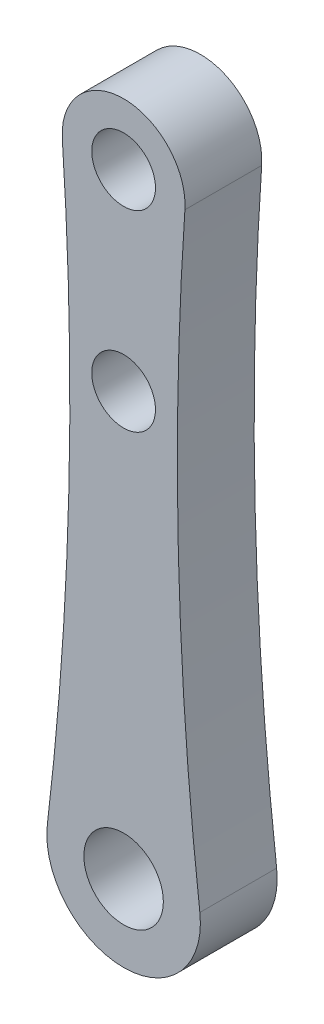
ISO-10303-21;
HEADER;
FILE_DESCRIPTION(('STEP AP214'),'2;1');
FILE_NAME('part.step','',(''),(''),'','','');
FILE_SCHEMA(('AUTOMOTIVE_DESIGN { 1 0 10303 214 1 1 1 1 }'));
ENDSEC;
DATA;
#1=APPLICATION_CONTEXT('core data for automotive mechanical design processes');
#2=APPLICATION_PROTOCOL_DEFINITION('international standard','automotive_design',2000,#1);
#3=PRODUCT_CONTEXT('',#1,'mechanical');
#4=PRODUCT('Part','Part','',(#3));
#5=PRODUCT_RELATED_PRODUCT_CATEGORY('part','',(#4));
#6=PRODUCT_DEFINITION_FORMATION('','',#4);
#7=PRODUCT_DEFINITION_CONTEXT('part definition',#1,'design');
#8=PRODUCT_DEFINITION('design','',#6,#7);
#9=PRODUCT_DEFINITION_SHAPE('','',#8);
#10=(LENGTH_UNIT() NAMED_UNIT(*) SI_UNIT(.MILLI.,.METRE.));
#11=(NAMED_UNIT(*) PLANE_ANGLE_UNIT() SI_UNIT($,.RADIAN.));
#12=(NAMED_UNIT(*) SI_UNIT($,.STERADIAN.) SOLID_ANGLE_UNIT());
#13=UNCERTAINTY_MEASURE_WITH_UNIT(LENGTH_MEASURE(1.E-05),#10,'distance_accuracy_value','');
#14=(GEOMETRIC_REPRESENTATION_CONTEXT(3) GLOBAL_UNCERTAINTY_ASSIGNED_CONTEXT((#13)) GLOBAL_UNIT_ASSIGNED_CONTEXT((#10,
#11,#12)) REPRESENTATION_CONTEXT('',''));
#15=CARTESIAN_POINT('',(0.,0.,0.));
#16=DIRECTION('',(0.,0.,1.));
#17=DIRECTION('',(1.,0.,0.));
#18=AXIS2_PLACEMENT_3D('',#15,#16,#17);
#19=CARTESIAN_POINT('',(-213.79243432618,25.3698108581539,10.));
#20=DIRECTION('',(0.,0.,1.));
#21=DIRECTION('',(1.,0.,0.));
#22=AXIS2_PLACEMENT_3D('',#19,#20,#21);
#23=PLANE('',#22);
#24=CARTESIAN_POINT('',(0.,40.,10.));
#25=DIRECTION('',(0.,0.,1.));
#26=DIRECTION('',(1.,0.,0.));
#27=AXIS2_PLACEMENT_3D('',#24,#25,#26);
#28=CIRCLE('',#27,4.15);
#29=CARTESIAN_POINT('',(4.14999999999999,40.,10.));
#30=VERTEX_POINT('',#29);
#31=EDGE_CURVE('E119',#30,#30,#28,.T.);
#32=ORIENTED_EDGE('',*,*,#31,.F.);
#33=EDGE_LOOP('',(#32));
#34=FACE_BOUND('',#33,.T.);
#35=CARTESIAN_POINT('',(-427.584868652359,10.7396217163078,10.));
#36=DIRECTION('',(0.,0.,-1.));
#37=DIRECTION('',(1.,0.,0.));
#38=AXIS2_PLACEMENT_3D('',#35,#36,#37);
#39=CIRCLE('',#38,420.584868652359);
#40=CARTESIAN_POINT('',(-7.98133391870525,39.4538234002391,10.));
#41=VERTEX_POINT('',#40);
#42=CARTESIAN_POINT('',(-9.9303273241023,-38.8216115936653,10.));
#43=VERTEX_POINT('',#42);
#44=EDGE_CURVE('E89',#41,#43,#39,.T.);
#45=ORIENTED_EDGE('',*,*,#44,.T.);
#46=CARTESIAN_POINT('',(0.,-40.,10.));
#47=DIRECTION('',(0.,0.,1.));
#48=DIRECTION('',(1.,0.,0.));
#49=AXIS2_PLACEMENT_3D('',#46,#47,#48);
#50=CIRCLE('',#49,9.99999999999984);
#51=CARTESIAN_POINT('',(9.93032732410226,-38.8216115936653,10.));
#52=VERTEX_POINT('',#51);
#53=EDGE_CURVE('E84',#43,#52,#50,.T.);
#54=ORIENTED_EDGE('',*,*,#53,.T.);
#55=CARTESIAN_POINT('',(427.584868652359,10.7396217163078,10.));
#56=DIRECTION('',(0.,0.,-1.));
#57=DIRECTION('',(-1.,0.,0.));
#58=AXIS2_PLACEMENT_3D('',#55,#56,#57);
#59=CIRCLE('',#58,420.584868652359);
#60=CARTESIAN_POINT('',(7.98133391870522,39.453823400239,10.));
#61=VERTEX_POINT('',#60);
#62=EDGE_CURVE('E87',#52,#61,#59,.T.);
#63=ORIENTED_EDGE('',*,*,#62,.T.);
#64=CARTESIAN_POINT('',(0.,40.,10.));
#65=DIRECTION('',(0.,0.,1.));
#66=DIRECTION('',(1.,0.,0.));
#67=AXIS2_PLACEMENT_3D('',#64,#65,#66);
#68=CIRCLE('',#67,8.00000000000007);
#69=EDGE_CURVE('E54',#61,#41,#68,.T.);
#70=ORIENTED_EDGE('',*,*,#69,.T.);
#71=EDGE_LOOP('',(#45,#54,#63,#70));
#72=FACE_BOUND('',#71,.T.);
#73=CARTESIAN_POINT('',(0.,-40.,10.));
#74=DIRECTION('',(0.,0.,1.));
#75=DIRECTION('',(1.,0.,0.));
#76=AXIS2_PLACEMENT_3D('',#73,#74,#75);
#77=CIRCLE('',#76,5.175);
#78=CARTESIAN_POINT('',(5.175,-40.,10.));
#79=VERTEX_POINT('',#78);
#80=EDGE_CURVE('E104',#79,#79,#77,.T.);
#81=ORIENTED_EDGE('',*,*,#80,.F.);
#82=EDGE_LOOP('',(#81));
#83=FACE_BOUND('',#82,.T.);
#84=CARTESIAN_POINT('',(0.,15.,10.));
#85=DIRECTION('',(0.,0.,1.));
#86=DIRECTION('',(1.,0.,0.));
#87=AXIS2_PLACEMENT_3D('',#84,#85,#86);
#88=CIRCLE('',#87,4.15);
#89=CARTESIAN_POINT('',(4.15,15.,10.));
#90=VERTEX_POINT('',#89);
#91=EDGE_CURVE('E125',#90,#90,#88,.T.);
#92=ORIENTED_EDGE('',*,*,#91,.F.);
#93=EDGE_LOOP('',(#92));
#94=FACE_BOUND('',#93,.T.);
#95=ADVANCED_FACE('F37',(#34,#72,#83,#94),#23,.T.);
#96=CARTESIAN_POINT('',(-213.79243432618,25.3698108581539,0.));
#97=DIRECTION('',(0.,0.,1.));
#98=DIRECTION('',(1.,0.,0.));
#99=AXIS2_PLACEMENT_3D('',#96,#97,#98);
#100=PLANE('',#99);
#101=CARTESIAN_POINT('',(-427.584868652359,10.7396217163078,0.));
#102=DIRECTION('',(0.,0.,-1.));
#103=DIRECTION('',(1.,0.,0.));
#104=AXIS2_PLACEMENT_3D('',#101,#102,#103);
#105=CIRCLE('',#104,420.584868652359);
#106=CARTESIAN_POINT('',(-7.98133391870525,39.4538234002391,0.));
#107=VERTEX_POINT('',#106);
#108=CARTESIAN_POINT('',(-9.9303273241023,-38.8216115936653,0.));
#109=VERTEX_POINT('',#108);
#110=EDGE_CURVE('E101',#107,#109,#105,.T.);
#111=ORIENTED_EDGE('',*,*,#110,.F.);
#112=CARTESIAN_POINT('',(0.,40.,0.));
#113=DIRECTION('',(0.,0.,1.));
#114=DIRECTION('',(1.,0.,0.));
#115=AXIS2_PLACEMENT_3D('',#112,#113,#114);
#116=CIRCLE('',#115,8.00000000000007);
#117=CARTESIAN_POINT('',(7.98133391870522,39.453823400239,0.));
#118=VERTEX_POINT('',#117);
#119=EDGE_CURVE('E77',#118,#107,#116,.T.);
#120=ORIENTED_EDGE('',*,*,#119,.F.);
#121=CARTESIAN_POINT('',(427.584868652359,10.7396217163078,0.));
#122=DIRECTION('',(0.,0.,-1.));
#123=DIRECTION('',(-1.,0.,0.));
#124=AXIS2_PLACEMENT_3D('',#121,#122,#123);
#125=CIRCLE('',#124,420.584868652359);
#126=CARTESIAN_POINT('',(9.93032732410226,-38.8216115936653,0.));
#127=VERTEX_POINT('',#126);
#128=EDGE_CURVE('E71',#127,#118,#125,.T.);
#129=ORIENTED_EDGE('',*,*,#128,.F.);
#130=CARTESIAN_POINT('',(0.,-40.,0.));
#131=DIRECTION('',(0.,0.,1.));
#132=DIRECTION('',(1.,0.,0.));
#133=AXIS2_PLACEMENT_3D('',#130,#131,#132);
#134=CIRCLE('',#133,9.99999999999984);
#135=EDGE_CURVE('E93',#109,#127,#134,.T.);
#136=ORIENTED_EDGE('',*,*,#135,.F.);
#137=EDGE_LOOP('',(#111,#120,#129,#136));
#138=FACE_BOUND('',#137,.T.);
#139=CARTESIAN_POINT('',(0.,-40.,0.));
#140=DIRECTION('',(0.,0.,1.));
#141=DIRECTION('',(1.,0.,0.));
#142=AXIS2_PLACEMENT_3D('',#139,#140,#141);
#143=CIRCLE('',#142,5.175);
#144=CARTESIAN_POINT('',(5.175,-40.,0.));
#145=VERTEX_POINT('',#144);
#146=EDGE_CURVE('E116',#145,#145,#143,.T.);
#147=ORIENTED_EDGE('',*,*,#146,.T.);
#148=EDGE_LOOP('',(#147));
#149=FACE_BOUND('',#148,.T.);
#150=CARTESIAN_POINT('',(0.,40.,0.));
#151=DIRECTION('',(0.,0.,1.));
#152=DIRECTION('',(1.,0.,0.));
#153=AXIS2_PLACEMENT_3D('',#150,#151,#152);
#154=CIRCLE('',#153,4.15);
#155=CARTESIAN_POINT('',(4.14999999999999,40.,0.));
#156=VERTEX_POINT('',#155);
#157=EDGE_CURVE('E122',#156,#156,#154,.T.);
#158=ORIENTED_EDGE('',*,*,#157,.T.);
#159=EDGE_LOOP('',(#158));
#160=FACE_BOUND('',#159,.T.);
#161=CARTESIAN_POINT('',(0.,15.,0.));
#162=DIRECTION('',(0.,0.,1.));
#163=DIRECTION('',(1.,0.,0.));
#164=AXIS2_PLACEMENT_3D('',#161,#162,#163);
#165=CIRCLE('',#164,4.15);
#166=CARTESIAN_POINT('',(4.15,15.,0.));
#167=VERTEX_POINT('',#166);
#168=EDGE_CURVE('E128',#167,#167,#165,.T.);
#169=ORIENTED_EDGE('',*,*,#168,.T.);
#170=EDGE_LOOP('',(#169));
#171=FACE_BOUND('',#170,.T.);
#172=ADVANCED_FACE('F112',(#138,#149,#160,#171),#100,.F.);
#173=CARTESIAN_POINT('',(-427.584868652359,10.7396217163078,10.));
#174=DIRECTION('',(0.,0.,-1.));
#175=DIRECTION('',(-1.,0.,0.));
#176=AXIS2_PLACEMENT_3D('',#173,#174,#175);
#177=CYLINDRICAL_SURFACE('',#176,420.584868652359);
#178=ORIENTED_EDGE('',*,*,#110,.T.);
#179=DIRECTION('',(0.,0.,-1.));
#180=VECTOR('',#179,1.);
#181=CARTESIAN_POINT('',(-9.9303273241023,-38.8216115936653,10.));
#182=LINE('',#181,#180);
#183=EDGE_CURVE('E11',#43,#109,#182,.T.);
#184=ORIENTED_EDGE('',*,*,#183,.F.);
#185=ORIENTED_EDGE('',*,*,#44,.F.);
#186=DIRECTION('',(0.,0.,-1.));
#187=VECTOR('',#186,1.);
#188=CARTESIAN_POINT('',(-7.98133391870525,39.4538234002391,10.));
#189=LINE('',#188,#187);
#190=EDGE_CURVE('E97',#41,#107,#189,.T.);
#191=ORIENTED_EDGE('',*,*,#190,.T.);
#192=EDGE_LOOP('',(#178,#184,#185,#191));
#193=FACE_BOUND('',#192,.T.);
#194=ADVANCED_FACE('F39',(#193),#177,.F.);
#195=CARTESIAN_POINT('',(0.,-40.,10.));
#196=DIRECTION('',(0.,0.,-1.));
#197=DIRECTION('',(-1.,0.,0.));
#198=AXIS2_PLACEMENT_3D('',#195,#196,#197);
#199=CYLINDRICAL_SURFACE('',#198,9.99999999999984);
#200=ORIENTED_EDGE('',*,*,#135,.T.);
#201=DIRECTION('',(0.,0.,-1.));
#202=VECTOR('',#201,1.);
#203=CARTESIAN_POINT('',(9.93032732410226,-38.8216115936653,10.));
#204=LINE('',#203,#202);
#205=EDGE_CURVE('E46',#52,#127,#204,.T.);
#206=ORIENTED_EDGE('',*,*,#205,.F.);
#207=ORIENTED_EDGE('',*,*,#53,.F.);
#208=ORIENTED_EDGE('',*,*,#183,.T.);
#209=EDGE_LOOP('',(#200,#206,#207,#208));
#210=FACE_BOUND('',#209,.T.);
#211=ADVANCED_FACE('F92',(#210),#199,.T.);
#212=CARTESIAN_POINT('',(427.584868652359,10.7396217163078,10.));
#213=DIRECTION('',(0.,0.,-1.));
#214=DIRECTION('',(-1.,0.,0.));
#215=AXIS2_PLACEMENT_3D('',#212,#213,#214);
#216=CYLINDRICAL_SURFACE('',#215,420.584868652359);
#217=ORIENTED_EDGE('',*,*,#128,.T.);
#218=DIRECTION('',(0.,0.,-1.));
#219=VECTOR('',#218,1.);
#220=CARTESIAN_POINT('',(7.98133391870522,39.453823400239,10.));
#221=LINE('',#220,#219);
#222=EDGE_CURVE('E94',#61,#118,#221,.T.);
#223=ORIENTED_EDGE('',*,*,#222,.F.);
#224=ORIENTED_EDGE('',*,*,#62,.F.);
#225=ORIENTED_EDGE('',*,*,#205,.T.);
#226=EDGE_LOOP('',(#217,#223,#224,#225));
#227=FACE_BOUND('',#226,.T.);
#228=ADVANCED_FACE('F95',(#227),#216,.F.);
#229=CARTESIAN_POINT('',(0.,40.,10.));
#230=DIRECTION('',(0.,0.,-1.));
#231=DIRECTION('',(-1.,0.,0.));
#232=AXIS2_PLACEMENT_3D('',#229,#230,#231);
#233=CYLINDRICAL_SURFACE('',#232,8.00000000000007);
#234=ORIENTED_EDGE('',*,*,#119,.T.);
#235=ORIENTED_EDGE('',*,*,#190,.F.);
#236=ORIENTED_EDGE('',*,*,#69,.F.);
#237=ORIENTED_EDGE('',*,*,#222,.T.);
#238=EDGE_LOOP('',(#234,#235,#236,#237));
#239=FACE_BOUND('',#238,.T.);
#240=ADVANCED_FACE('F109',(#239),#233,.T.);
#241=CARTESIAN_POINT('',(0.,-40.,10.));
#242=DIRECTION('',(0.,0.,-1.));
#243=DIRECTION('',(-1.,0.,0.));
#244=AXIS2_PLACEMENT_3D('',#241,#242,#243);
#245=CYLINDRICAL_SURFACE('',#244,5.175);
#246=ORIENTED_EDGE('',*,*,#80,.T.);
#247=EDGE_LOOP('',(#246));
#248=FACE_BOUND('',#247,.T.);
#249=ORIENTED_EDGE('',*,*,#146,.F.);
#250=EDGE_LOOP('',(#249));
#251=FACE_BOUND('',#250,.T.);
#252=ADVANCED_FACE('F146',(#248,#251),#245,.F.);
#253=CARTESIAN_POINT('',(0.,40.,10.));
#254=DIRECTION('',(0.,0.,-1.));
#255=DIRECTION('',(-1.,0.,0.));
#256=AXIS2_PLACEMENT_3D('',#253,#254,#255);
#257=CYLINDRICAL_SURFACE('',#256,4.15);
#258=ORIENTED_EDGE('',*,*,#31,.T.);
#259=EDGE_LOOP('',(#258));
#260=FACE_BOUND('',#259,.T.);
#261=ORIENTED_EDGE('',*,*,#157,.F.);
#262=EDGE_LOOP('',(#261));
#263=FACE_BOUND('',#262,.T.);
#264=ADVANCED_FACE('F192',(#260,#263),#257,.F.);
#265=CARTESIAN_POINT('',(0.,15.,10.));
#266=DIRECTION('',(0.,0.,-1.));
#267=DIRECTION('',(-1.,0.,0.));
#268=AXIS2_PLACEMENT_3D('',#265,#266,#267);
#269=CYLINDRICAL_SURFACE('',#268,4.15);
#270=ORIENTED_EDGE('',*,*,#91,.T.);
#271=EDGE_LOOP('',(#270));
#272=FACE_BOUND('',#271,.T.);
#273=ORIENTED_EDGE('',*,*,#168,.F.);
#274=EDGE_LOOP('',(#273));
#275=FACE_BOUND('',#274,.T.);
#276=ADVANCED_FACE('F134',(#272,#275),#269,.F.);
#277=CLOSED_SHELL('',(#95,#172,#194,#211,#228,#240,#252,#264,#276));
#278=MANIFOLD_SOLID_BREP('B2',#277);
#279=ADVANCED_BREP_SHAPE_REPRESENTATION('',(#18,#278),#14);
#280=SHAPE_DEFINITION_REPRESENTATION(#9,#279);
ENDSEC;
END-ISO-10303-21;
